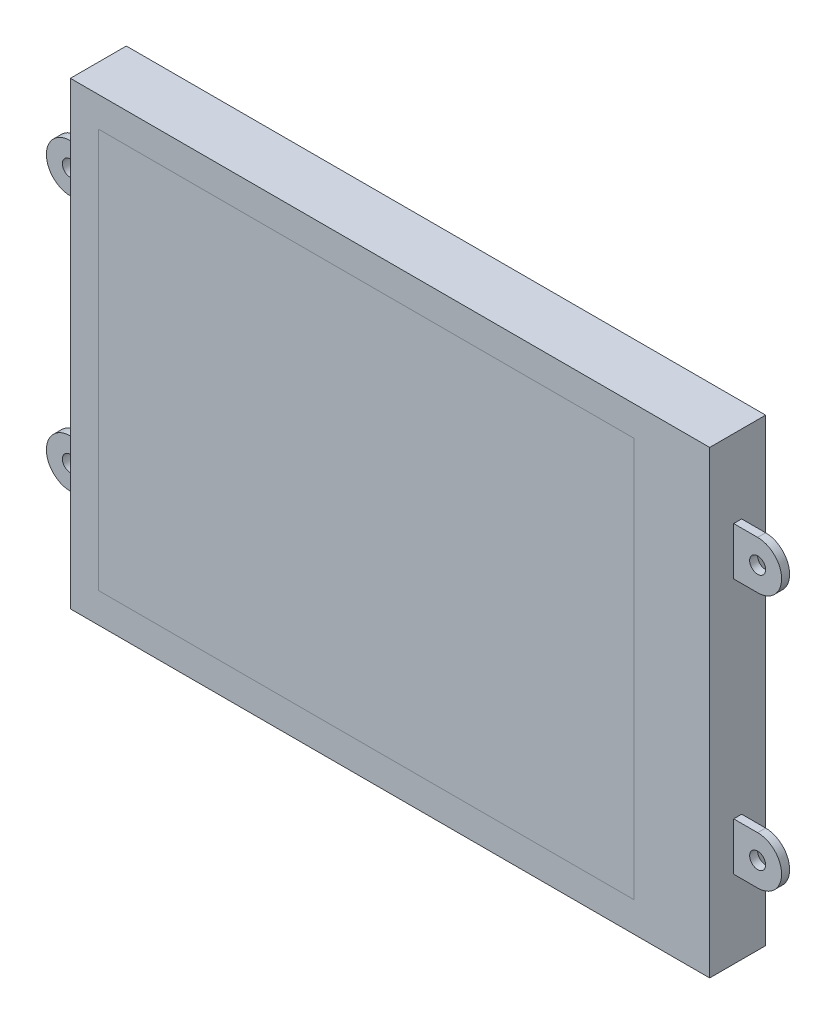
ISO-10303-21;
HEADER;
FILE_DESCRIPTION(('STEP AP214'),'2;1');
FILE_NAME('part.step','',(''),(''),'','','');
FILE_SCHEMA(('AUTOMOTIVE_DESIGN { 1 0 10303 214 1 1 1 1 }'));
ENDSEC;
DATA;
#1=APPLICATION_CONTEXT('core data for automotive mechanical design processes');
#2=APPLICATION_PROTOCOL_DEFINITION('international standard','automotive_design',2000,#1);
#3=PRODUCT_CONTEXT('',#1,'mechanical');
#4=PRODUCT('Part','Part','',(#3));
#5=PRODUCT_RELATED_PRODUCT_CATEGORY('part','',(#4));
#6=PRODUCT_DEFINITION_FORMATION('','',#4);
#7=PRODUCT_DEFINITION_CONTEXT('part definition',#1,'design');
#8=PRODUCT_DEFINITION('design','',#6,#7);
#9=PRODUCT_DEFINITION_SHAPE('','',#8);
#10=(LENGTH_UNIT() NAMED_UNIT(*) SI_UNIT(.MILLI.,.METRE.));
#11=(NAMED_UNIT(*) PLANE_ANGLE_UNIT() SI_UNIT($,.RADIAN.));
#12=(NAMED_UNIT(*) SI_UNIT($,.STERADIAN.) SOLID_ANGLE_UNIT());
#13=UNCERTAINTY_MEASURE_WITH_UNIT(LENGTH_MEASURE(1.E-05),#10,'distance_accuracy_value','');
#14=(GEOMETRIC_REPRESENTATION_CONTEXT(3) GLOBAL_UNCERTAINTY_ASSIGNED_CONTEXT((#13)) GLOBAL_UNIT_ASSIGNED_CONTEXT((#10,
#11,#12)) REPRESENTATION_CONTEXT('',''));
#15=CARTESIAN_POINT('',(0.,0.,0.));
#16=DIRECTION('',(0.,0.,1.));
#17=DIRECTION('',(1.,0.,0.));
#18=AXIS2_PLACEMENT_3D('',#15,#16,#17);
#19=CARTESIAN_POINT('',(0.,0.,3.5));
#20=DIRECTION('',(0.,0.,-1.));
#21=DIRECTION('',(-1.,0.,0.));
#22=AXIS2_PLACEMENT_3D('',#19,#20,#21);
#23=PLANE('',#22);
#24=DIRECTION('',(0.,1.,0.));
#25=VECTOR('',#24,1.);
#26=CARTESIAN_POINT('',(40.,-28.75,3.5));
#27=LINE('',#26,#25);
#28=CARTESIAN_POINT('',(40.,-28.75,3.5));
#29=VERTEX_POINT('',#28);
#30=CARTESIAN_POINT('',(40.,28.75,3.5));
#31=VERTEX_POINT('',#30);
#32=EDGE_CURVE('E327',#29,#31,#27,.T.);
#33=ORIENTED_EDGE('',*,*,#32,.T.);
#34=DIRECTION('',(-1.,0.,0.));
#35=VECTOR('',#34,1.);
#36=CARTESIAN_POINT('',(-40.,28.75,3.5));
#37=LINE('',#36,#35);
#38=CARTESIAN_POINT('',(-40.,28.75,3.5));
#39=VERTEX_POINT('',#38);
#40=EDGE_CURVE('E330',#31,#39,#37,.T.);
#41=ORIENTED_EDGE('',*,*,#40,.T.);
#42=DIRECTION('',(0.,-1.,0.));
#43=VECTOR('',#42,1.);
#44=CARTESIAN_POINT('',(-40.,-28.75,3.5));
#45=LINE('',#44,#43);
#46=CARTESIAN_POINT('',(-40.,-28.75,3.5));
#47=VERTEX_POINT('',#46);
#48=EDGE_CURVE('E333',#39,#47,#45,.T.);
#49=ORIENTED_EDGE('',*,*,#48,.T.);
#50=DIRECTION('',(1.,0.,0.));
#51=VECTOR('',#50,1.);
#52=CARTESIAN_POINT('',(-40.,-28.75,3.5));
#53=LINE('',#52,#51);
#54=EDGE_CURVE('E335',#47,#29,#53,.T.);
#55=ORIENTED_EDGE('',*,*,#54,.T.);
#56=EDGE_LOOP('',(#33,#41,#49,#55));
#57=FACE_BOUND('',#56,.T.);
#58=DIRECTION('',(0.,1.,0.));
#59=VECTOR('',#58,1.);
#60=CARTESIAN_POINT('',(30.5,0.,3.5));
#61=LINE('',#60,#59);
#62=CARTESIAN_POINT('',(30.5,-25.,3.5));
#63=VERTEX_POINT('',#62);
#64=CARTESIAN_POINT('',(30.5,25.,3.5));
#65=VERTEX_POINT('',#64);
#66=EDGE_CURVE('E11',#63,#65,#61,.T.);
#67=ORIENTED_EDGE('',*,*,#66,.F.);
#68=DIRECTION('',(1.,0.,0.));
#69=VECTOR('',#68,1.);
#70=CARTESIAN_POINT('',(0.,-25.,3.5));
#71=LINE('',#70,#69);
#72=CARTESIAN_POINT('',(-36.5,-25.,3.5));
#73=VERTEX_POINT('',#72);
#74=EDGE_CURVE('E356',#73,#63,#71,.T.);
#75=ORIENTED_EDGE('',*,*,#74,.F.);
#76=DIRECTION('',(0.,-1.,0.));
#77=VECTOR('',#76,1.);
#78=CARTESIAN_POINT('',(-36.5,0.,3.5));
#79=LINE('',#78,#77);
#80=CARTESIAN_POINT('',(-36.5,25.,3.5));
#81=VERTEX_POINT('',#80);
#82=EDGE_CURVE('E359',#81,#73,#79,.T.);
#83=ORIENTED_EDGE('',*,*,#82,.F.);
#84=DIRECTION('',(-1.,0.,0.));
#85=VECTOR('',#84,1.);
#86=CARTESIAN_POINT('',(0.,25.,3.5));
#87=LINE('',#86,#85);
#88=EDGE_CURVE('E46',#65,#81,#87,.T.);
#89=ORIENTED_EDGE('',*,*,#88,.F.);
#90=EDGE_LOOP('',(#67,#75,#83,#89));
#91=FACE_BOUND('',#90,.T.);
#92=ADVANCED_FACE('F37',(#57,#91),#23,.F.);
#93=CARTESIAN_POINT('',(-40.,-28.75,3.5));
#94=DIRECTION('',(1.,0.,0.));
#95=DIRECTION('',(0.,0.,-1.));
#96=AXIS2_PLACEMENT_3D('',#93,#94,#95);
#97=PLANE('',#96);
#98=DIRECTION('',(0.,0.,-1.));
#99=VECTOR('',#98,1.);
#100=CARTESIAN_POINT('',(-40.,13.,0.5));
#101=LINE('',#100,#99);
#102=CARTESIAN_POINT('',(-40.,13.,0.5));
#103=VERTEX_POINT('',#102);
#104=CARTESIAN_POINT('',(-40.,13.,-0.5));
#105=VERTEX_POINT('',#104);
#106=EDGE_CURVE('E247',#103,#105,#101,.T.);
#107=ORIENTED_EDGE('',*,*,#106,.T.);
#108=DIRECTION('',(0.,1.,0.));
#109=VECTOR('',#108,1.);
#110=CARTESIAN_POINT('',(-40.,13.,-0.5));
#111=LINE('',#110,#109);
#112=CARTESIAN_POINT('',(-40.,19.,-0.5));
#113=VERTEX_POINT('',#112);
#114=EDGE_CURVE('E239',#105,#113,#111,.T.);
#115=ORIENTED_EDGE('',*,*,#114,.T.);
#116=DIRECTION('',(0.,0.,-1.));
#117=VECTOR('',#116,1.);
#118=CARTESIAN_POINT('',(-40.,19.,0.5));
#119=LINE('',#118,#117);
#120=CARTESIAN_POINT('',(-40.,19.,0.5));
#121=VERTEX_POINT('',#120);
#122=EDGE_CURVE('E244',#121,#113,#119,.T.);
#123=ORIENTED_EDGE('',*,*,#122,.F.);
#124=DIRECTION('',(0.,1.,0.));
#125=VECTOR('',#124,1.);
#126=CARTESIAN_POINT('',(-40.,13.,0.5));
#127=LINE('',#126,#125);
#128=EDGE_CURVE('E228',#103,#121,#127,.T.);
#129=ORIENTED_EDGE('',*,*,#128,.F.);
#130=EDGE_LOOP('',(#107,#115,#123,#129));
#131=FACE_BOUND('',#130,.T.);
#132=DIRECTION('',(0.,-1.,0.));
#133=VECTOR('',#132,1.);
#134=CARTESIAN_POINT('',(-40.,-28.75,-3.5));
#135=LINE('',#134,#133);
#136=CARTESIAN_POINT('',(-40.,28.75,-3.5));
#137=VERTEX_POINT('',#136);
#138=CARTESIAN_POINT('',(-40.,-28.75,-3.5));
#139=VERTEX_POINT('',#138);
#140=EDGE_CURVE('E342',#137,#139,#135,.T.);
#141=ORIENTED_EDGE('',*,*,#140,.T.);
#142=DIRECTION('',(0.,0.,-1.));
#143=VECTOR('',#142,1.);
#144=CARTESIAN_POINT('',(-40.,-28.75,3.5));
#145=LINE('',#144,#143);
#146=EDGE_CURVE('E347',#47,#139,#145,.T.);
#147=ORIENTED_EDGE('',*,*,#146,.F.);
#148=ORIENTED_EDGE('',*,*,#48,.F.);
#149=DIRECTION('',(0.,0.,-1.));
#150=VECTOR('',#149,1.);
#151=CARTESIAN_POINT('',(-40.,28.75,3.5));
#152=LINE('',#151,#150);
#153=EDGE_CURVE('E350',#39,#137,#152,.T.);
#154=ORIENTED_EDGE('',*,*,#153,.T.);
#155=EDGE_LOOP('',(#141,#147,#148,#154));
#156=FACE_BOUND('',#155,.T.);
#157=DIRECTION('',(0.,0.,-1.));
#158=VECTOR('',#157,1.);
#159=CARTESIAN_POINT('',(-40.,-19.,0.5));
#160=LINE('',#159,#158);
#161=CARTESIAN_POINT('',(-40.,-19.,0.5));
#162=VERTEX_POINT('',#161);
#163=CARTESIAN_POINT('',(-40.,-19.,-0.5));
#164=VERTEX_POINT('',#163);
#165=EDGE_CURVE('E190',#162,#164,#160,.T.);
#166=ORIENTED_EDGE('',*,*,#165,.T.);
#167=DIRECTION('',(0.,1.,0.));
#168=VECTOR('',#167,1.);
#169=CARTESIAN_POINT('',(-40.,-13.,-0.5));
#170=LINE('',#169,#168);
#171=CARTESIAN_POINT('',(-40.,-13.,-0.5));
#172=VERTEX_POINT('',#171);
#173=EDGE_CURVE('E415',#164,#172,#170,.T.);
#174=ORIENTED_EDGE('',*,*,#173,.T.);
#175=DIRECTION('',(0.,0.,-1.));
#176=VECTOR('',#175,1.);
#177=CARTESIAN_POINT('',(-40.,-13.,0.5));
#178=LINE('',#177,#176);
#179=CARTESIAN_POINT('',(-40.,-13.,0.5));
#180=VERTEX_POINT('',#179);
#181=EDGE_CURVE('E214',#180,#172,#178,.T.);
#182=ORIENTED_EDGE('',*,*,#181,.F.);
#183=DIRECTION('',(0.,1.,0.));
#184=VECTOR('',#183,1.);
#185=CARTESIAN_POINT('',(-40.,-13.,0.5));
#186=LINE('',#185,#184);
#187=EDGE_CURVE('E193',#162,#180,#186,.T.);
#188=ORIENTED_EDGE('',*,*,#187,.F.);
#189=EDGE_LOOP('',(#166,#174,#182,#188));
#190=FACE_BOUND('',#189,.T.);
#191=ADVANCED_FACE('F374',(#131,#156,#190),#97,.F.);
#192=CARTESIAN_POINT('',(40.,-28.75,3.5));
#193=DIRECTION('',(-1.,0.,0.));
#194=DIRECTION('',(0.,0.,1.));
#195=AXIS2_PLACEMENT_3D('',#192,#193,#194);
#196=PLANE('',#195);
#197=DIRECTION('',(0.,0.,-1.));
#198=VECTOR('',#197,1.);
#199=CARTESIAN_POINT('',(40.,13.,0.5));
#200=LINE('',#199,#198);
#201=CARTESIAN_POINT('',(40.,13.,0.5));
#202=VERTEX_POINT('',#201);
#203=CARTESIAN_POINT('',(40.,13.,-0.5));
#204=VERTEX_POINT('',#203);
#205=EDGE_CURVE('E323',#202,#204,#200,.T.);
#206=ORIENTED_EDGE('',*,*,#205,.F.);
#207=DIRECTION('',(0.,-1.,0.));
#208=VECTOR('',#207,1.);
#209=CARTESIAN_POINT('',(40.,19.,0.5));
#210=LINE('',#209,#208);
#211=CARTESIAN_POINT('',(40.,19.,0.5));
#212=VERTEX_POINT('',#211);
#213=EDGE_CURVE('E297',#212,#202,#210,.T.);
#214=ORIENTED_EDGE('',*,*,#213,.F.);
#215=DIRECTION('',(0.,0.,-1.));
#216=VECTOR('',#215,1.);
#217=CARTESIAN_POINT('',(40.,19.,0.5));
#218=LINE('',#217,#216);
#219=CARTESIAN_POINT('',(40.,19.,-0.5));
#220=VERTEX_POINT('',#219);
#221=EDGE_CURVE('E308',#212,#220,#218,.T.);
#222=ORIENTED_EDGE('',*,*,#221,.T.);
#223=DIRECTION('',(0.,-1.,0.));
#224=VECTOR('',#223,1.);
#225=CARTESIAN_POINT('',(40.,19.,-0.5));
#226=LINE('',#225,#224);
#227=EDGE_CURVE('E294',#220,#204,#226,.T.);
#228=ORIENTED_EDGE('',*,*,#227,.T.);
#229=EDGE_LOOP('',(#206,#214,#222,#228));
#230=FACE_BOUND('',#229,.T.);
#231=DIRECTION('',(0.,1.,0.));
#232=VECTOR('',#231,1.);
#233=CARTESIAN_POINT('',(40.,-28.75,-3.5));
#234=LINE('',#233,#232);
#235=CARTESIAN_POINT('',(40.,-28.75,-3.5));
#236=VERTEX_POINT('',#235);
#237=CARTESIAN_POINT('',(40.,28.75,-3.5));
#238=VERTEX_POINT('',#237);
#239=EDGE_CURVE('E326',#236,#238,#234,.T.);
#240=ORIENTED_EDGE('',*,*,#239,.T.);
#241=DIRECTION('',(0.,0.,-1.));
#242=VECTOR('',#241,1.);
#243=CARTESIAN_POINT('',(40.,28.75,3.5));
#244=LINE('',#243,#242);
#245=EDGE_CURVE('E353',#31,#238,#244,.T.);
#246=ORIENTED_EDGE('',*,*,#245,.F.);
#247=ORIENTED_EDGE('',*,*,#32,.F.);
#248=DIRECTION('',(0.,0.,-1.));
#249=VECTOR('',#248,1.);
#250=CARTESIAN_POINT('',(40.,-28.75,3.5));
#251=LINE('',#250,#249);
#252=EDGE_CURVE('E337',#29,#236,#251,.T.);
#253=ORIENTED_EDGE('',*,*,#252,.T.);
#254=EDGE_LOOP('',(#240,#246,#247,#253));
#255=FACE_BOUND('',#254,.T.);
#256=DIRECTION('',(0.,0.,-1.));
#257=VECTOR('',#256,1.);
#258=CARTESIAN_POINT('',(40.,-13.,0.5));
#259=LINE('',#258,#257);
#260=CARTESIAN_POINT('',(40.,-13.,0.5));
#261=VERTEX_POINT('',#260);
#262=CARTESIAN_POINT('',(40.,-13.,-0.5));
#263=VERTEX_POINT('',#262);
#264=EDGE_CURVE('E285',#261,#263,#259,.T.);
#265=ORIENTED_EDGE('',*,*,#264,.T.);
#266=DIRECTION('',(0.,-1.,0.));
#267=VECTOR('',#266,1.);
#268=CARTESIAN_POINT('',(40.,-13.,-0.5));
#269=LINE('',#268,#267);
#270=CARTESIAN_POINT('',(40.,-19.,-0.5));
#271=VERTEX_POINT('',#270);
#272=EDGE_CURVE('E277',#263,#271,#269,.T.);
#273=ORIENTED_EDGE('',*,*,#272,.T.);
#274=DIRECTION('',(0.,0.,-1.));
#275=VECTOR('',#274,1.);
#276=CARTESIAN_POINT('',(40.,-19.,0.5));
#277=LINE('',#276,#275);
#278=CARTESIAN_POINT('',(40.,-19.,0.5));
#279=VERTEX_POINT('',#278);
#280=EDGE_CURVE('E282',#279,#271,#277,.T.);
#281=ORIENTED_EDGE('',*,*,#280,.F.);
#282=DIRECTION('',(0.,-1.,0.));
#283=VECTOR('',#282,1.);
#284=CARTESIAN_POINT('',(40.,-13.,0.5));
#285=LINE('',#284,#283);
#286=EDGE_CURVE('E266',#261,#279,#285,.T.);
#287=ORIENTED_EDGE('',*,*,#286,.F.);
#288=EDGE_LOOP('',(#265,#273,#281,#287));
#289=FACE_BOUND('',#288,.T.);
#290=ADVANCED_FACE('F39',(#230,#255,#289),#196,.F.);
#291=CARTESIAN_POINT('',(-40.,28.75,3.5));
#292=DIRECTION('',(0.,-1.,0.));
#293=DIRECTION('',(0.,0.,-1.));
#294=AXIS2_PLACEMENT_3D('',#291,#292,#293);
#295=PLANE('',#294);
#296=DIRECTION('',(-1.,0.,0.));
#297=VECTOR('',#296,1.);
#298=CARTESIAN_POINT('',(-40.,28.75,-3.5));
#299=LINE('',#298,#297);
#300=EDGE_CURVE('E340',#238,#137,#299,.T.);
#301=ORIENTED_EDGE('',*,*,#300,.T.);
#302=ORIENTED_EDGE('',*,*,#153,.F.);
#303=ORIENTED_EDGE('',*,*,#40,.F.);
#304=ORIENTED_EDGE('',*,*,#245,.T.);
#305=EDGE_LOOP('',(#301,#302,#303,#304));
#306=FACE_BOUND('',#305,.T.);
#307=ADVANCED_FACE('F393',(#306),#295,.F.);
#308=CARTESIAN_POINT('',(-40.,-28.75,3.5));
#309=DIRECTION('',(0.,1.,0.));
#310=DIRECTION('',(0.,0.,1.));
#311=AXIS2_PLACEMENT_3D('',#308,#309,#310);
#312=PLANE('',#311);
#313=DIRECTION('',(1.,0.,0.));
#314=VECTOR('',#313,1.);
#315=CARTESIAN_POINT('',(-40.,-28.75,-3.5));
#316=LINE('',#315,#314);
#317=EDGE_CURVE('E331',#139,#236,#316,.T.);
#318=ORIENTED_EDGE('',*,*,#317,.T.);
#319=ORIENTED_EDGE('',*,*,#252,.F.);
#320=ORIENTED_EDGE('',*,*,#54,.F.);
#321=ORIENTED_EDGE('',*,*,#146,.T.);
#322=EDGE_LOOP('',(#318,#319,#320,#321));
#323=FACE_BOUND('',#322,.T.);
#324=ADVANCED_FACE('F386',(#323),#312,.F.);
#325=ORIENTED_EDGE('',*,*,#74,.T.);
#326=ORIENTED_EDGE('',*,*,#66,.T.);
#327=ORIENTED_EDGE('',*,*,#88,.T.);
#328=ORIENTED_EDGE('',*,*,#82,.T.);
#329=EDGE_LOOP('',(#325,#326,#327,#328));
#330=FACE_BOUND('',#329,.T.);
#331=ADVANCED_FACE('F371',(#330),#23,.F.);
#332=CARTESIAN_POINT('',(0.,0.,-3.5));
#333=DIRECTION('',(0.,0.,-1.));
#334=DIRECTION('',(-1.,0.,0.));
#335=AXIS2_PLACEMENT_3D('',#332,#333,#334);
#336=PLANE('',#335);
#337=ORIENTED_EDGE('',*,*,#239,.F.);
#338=ORIENTED_EDGE('',*,*,#317,.F.);
#339=ORIENTED_EDGE('',*,*,#140,.F.);
#340=ORIENTED_EDGE('',*,*,#300,.F.);
#341=EDGE_LOOP('',(#337,#338,#339,#340));
#342=FACE_BOUND('',#341,.T.);
#343=ADVANCED_FACE('F385',(#342),#336,.T.);
#344=CARTESIAN_POINT('',(43.,16.,0.5));
#345=DIRECTION('',(0.,0.,1.));
#346=DIRECTION('',(1.,0.,0.));
#347=AXIS2_PLACEMENT_3D('',#344,#345,#346);
#348=PLANE('',#347);
#349=ORIENTED_EDGE('',*,*,#213,.T.);
#350=DIRECTION('',(1.,0.,0.));
#351=VECTOR('',#350,1.);
#352=CARTESIAN_POINT('',(43.,13.,0.5));
#353=LINE('',#352,#351);
#354=CARTESIAN_POINT('',(43.,13.,0.5));
#355=VERTEX_POINT('',#354);
#356=EDGE_CURVE('E300',#202,#355,#353,.T.);
#357=ORIENTED_EDGE('',*,*,#356,.T.);
#358=CARTESIAN_POINT('',(43.,16.,0.5));
#359=DIRECTION('',(0.,0.,1.));
#360=DIRECTION('',(1.,0.,0.));
#361=AXIS2_PLACEMENT_3D('',#358,#359,#360);
#362=CIRCLE('',#361,3.);
#363=CARTESIAN_POINT('',(43.,19.,0.5));
#364=VERTEX_POINT('',#363);
#365=EDGE_CURVE('E303',#355,#364,#362,.T.);
#366=ORIENTED_EDGE('',*,*,#365,.T.);
#367=DIRECTION('',(-1.,0.,0.));
#368=VECTOR('',#367,1.);
#369=CARTESIAN_POINT('',(40.,19.,0.5));
#370=LINE('',#369,#368);
#371=EDGE_CURVE('E305',#364,#212,#370,.T.);
#372=ORIENTED_EDGE('',*,*,#371,.T.);
#373=EDGE_LOOP('',(#349,#357,#366,#372));
#374=FACE_BOUND('',#373,.T.);
#375=CARTESIAN_POINT('',(43.,16.,0.5));
#376=DIRECTION('',(0.,0.,1.));
#377=DIRECTION('',(1.,0.,0.));
#378=AXIS2_PLACEMENT_3D('',#375,#376,#377);
#379=CIRCLE('',#378,0.999999999999998);
#380=CARTESIAN_POINT('',(44.,16.,0.5));
#381=VERTEX_POINT('',#380);
#382=EDGE_CURVE('E291',#381,#381,#379,.T.);
#383=ORIENTED_EDGE('',*,*,#382,.F.);
#384=EDGE_LOOP('',(#383));
#385=FACE_BOUND('',#384,.T.);
#386=ADVANCED_FACE('F391',(#374,#385),#348,.T.);
#387=CARTESIAN_POINT('',(43.,16.,-0.5));
#388=DIRECTION('',(0.,0.,1.));
#389=DIRECTION('',(1.,0.,0.));
#390=AXIS2_PLACEMENT_3D('',#387,#388,#389);
#391=PLANE('',#390);
#392=ORIENTED_EDGE('',*,*,#227,.F.);
#393=DIRECTION('',(-1.,0.,0.));
#394=VECTOR('',#393,1.);
#395=CARTESIAN_POINT('',(40.,19.,-0.5));
#396=LINE('',#395,#394);
#397=CARTESIAN_POINT('',(43.,19.,-0.5));
#398=VERTEX_POINT('',#397);
#399=EDGE_CURVE('E301',#398,#220,#396,.T.);
#400=ORIENTED_EDGE('',*,*,#399,.F.);
#401=CARTESIAN_POINT('',(43.,16.,-0.5));
#402=DIRECTION('',(0.,0.,1.));
#403=DIRECTION('',(1.,0.,0.));
#404=AXIS2_PLACEMENT_3D('',#401,#402,#403);
#405=CIRCLE('',#404,3.);
#406=CARTESIAN_POINT('',(43.,13.,-0.5));
#407=VERTEX_POINT('',#406);
#408=EDGE_CURVE('E312',#407,#398,#405,.T.);
#409=ORIENTED_EDGE('',*,*,#408,.F.);
#410=DIRECTION('',(1.,0.,0.));
#411=VECTOR('',#410,1.);
#412=CARTESIAN_POINT('',(43.,13.,-0.5));
#413=LINE('',#412,#411);
#414=EDGE_CURVE('E310',#204,#407,#413,.T.);
#415=ORIENTED_EDGE('',*,*,#414,.F.);
#416=EDGE_LOOP('',(#392,#400,#409,#415));
#417=FACE_BOUND('',#416,.T.);
#418=CARTESIAN_POINT('',(43.,16.,-0.5));
#419=DIRECTION('',(0.,0.,1.));
#420=DIRECTION('',(1.,0.,0.));
#421=AXIS2_PLACEMENT_3D('',#418,#419,#420);
#422=CIRCLE('',#421,0.999999999999998);
#423=CARTESIAN_POINT('',(44.,16.,-0.5));
#424=VERTEX_POINT('',#423);
#425=EDGE_CURVE('E290',#424,#424,#422,.T.);
#426=ORIENTED_EDGE('',*,*,#425,.T.);
#427=EDGE_LOOP('',(#426));
#428=FACE_BOUND('',#427,.T.);
#429=ADVANCED_FACE('F513',(#417,#428),#391,.F.);
#430=CARTESIAN_POINT('',(43.,13.,0.5));
#431=DIRECTION('',(0.,1.,0.));
#432=DIRECTION('',(-1.,0.,0.));
#433=AXIS2_PLACEMENT_3D('',#430,#431,#432);
#434=PLANE('',#433);
#435=ORIENTED_EDGE('',*,*,#414,.T.);
#436=DIRECTION('',(0.,0.,-1.));
#437=VECTOR('',#436,1.);
#438=CARTESIAN_POINT('',(43.,13.,0.5));
#439=LINE('',#438,#437);
#440=EDGE_CURVE('E320',#355,#407,#439,.T.);
#441=ORIENTED_EDGE('',*,*,#440,.F.);
#442=ORIENTED_EDGE('',*,*,#356,.F.);
#443=ORIENTED_EDGE('',*,*,#205,.T.);
#444=EDGE_LOOP('',(#435,#441,#442,#443));
#445=FACE_BOUND('',#444,.T.);
#446=ADVANCED_FACE('F517',(#445),#434,.F.);
#447=CARTESIAN_POINT('',(43.,16.,0.5));
#448=DIRECTION('',(0.,0.,-1.));
#449=DIRECTION('',(-1.,0.,0.));
#450=AXIS2_PLACEMENT_3D('',#447,#448,#449);
#451=CYLINDRICAL_SURFACE('',#450,3.);
#452=ORIENTED_EDGE('',*,*,#408,.T.);
#453=DIRECTION('',(0.,0.,-1.));
#454=VECTOR('',#453,1.);
#455=CARTESIAN_POINT('',(43.,19.,0.5));
#456=LINE('',#455,#454);
#457=EDGE_CURVE('E317',#364,#398,#456,.T.);
#458=ORIENTED_EDGE('',*,*,#457,.F.);
#459=ORIENTED_EDGE('',*,*,#365,.F.);
#460=ORIENTED_EDGE('',*,*,#440,.T.);
#461=EDGE_LOOP('',(#452,#458,#459,#460));
#462=FACE_BOUND('',#461,.T.);
#463=ADVANCED_FACE('F521',(#462),#451,.T.);
#464=CARTESIAN_POINT('',(40.,19.,0.5));
#465=DIRECTION('',(0.,-1.,0.));
#466=DIRECTION('',(0.,0.,-1.));
#467=AXIS2_PLACEMENT_3D('',#464,#465,#466);
#468=PLANE('',#467);
#469=ORIENTED_EDGE('',*,*,#399,.T.);
#470=ORIENTED_EDGE('',*,*,#221,.F.);
#471=ORIENTED_EDGE('',*,*,#371,.F.);
#472=ORIENTED_EDGE('',*,*,#457,.T.);
#473=EDGE_LOOP('',(#469,#470,#471,#472));
#474=FACE_BOUND('',#473,.T.);
#475=ADVANCED_FACE('F509',(#474),#468,.F.);
#476=CARTESIAN_POINT('',(43.,16.,0.5));
#477=DIRECTION('',(0.,0.,-1.));
#478=DIRECTION('',(-1.,0.,0.));
#479=AXIS2_PLACEMENT_3D('',#476,#477,#478);
#480=CYLINDRICAL_SURFACE('',#479,0.999999999999998);
#481=ORIENTED_EDGE('',*,*,#382,.T.);
#482=EDGE_LOOP('',(#481));
#483=FACE_BOUND('',#482,.T.);
#484=ORIENTED_EDGE('',*,*,#425,.F.);
#485=EDGE_LOOP('',(#484));
#486=FACE_BOUND('',#485,.T.);
#487=ADVANCED_FACE('F491',(#483,#486),#480,.F.);
#488=CARTESIAN_POINT('',(43.,-16.,0.5));
#489=DIRECTION('',(0.,0.,1.));
#490=DIRECTION('',(1.,0.,0.));
#491=AXIS2_PLACEMENT_3D('',#488,#489,#490);
#492=PLANE('',#491);
#493=CARTESIAN_POINT('',(43.,-16.,0.5));
#494=DIRECTION('',(0.,0.,1.));
#495=DIRECTION('',(1.,0.,0.));
#496=AXIS2_PLACEMENT_3D('',#493,#494,#495);
#497=CIRCLE('',#496,3.);
#498=CARTESIAN_POINT('',(43.,-19.,0.5));
#499=VERTEX_POINT('',#498);
#500=CARTESIAN_POINT('',(43.,-13.,0.5));
#501=VERTEX_POINT('',#500);
#502=EDGE_CURVE('E259',#499,#501,#497,.T.);
#503=ORIENTED_EDGE('',*,*,#502,.T.);
#504=DIRECTION('',(-1.,0.,0.));
#505=VECTOR('',#504,1.);
#506=CARTESIAN_POINT('',(43.,-13.,0.5));
#507=LINE('',#506,#505);
#508=EDGE_CURVE('E262',#501,#261,#507,.T.);
#509=ORIENTED_EDGE('',*,*,#508,.T.);
#510=ORIENTED_EDGE('',*,*,#286,.T.);
#511=DIRECTION('',(1.,0.,0.));
#512=VECTOR('',#511,1.);
#513=CARTESIAN_POINT('',(43.,-19.,0.5));
#514=LINE('',#513,#512);
#515=EDGE_CURVE('E269',#279,#499,#514,.T.);
#516=ORIENTED_EDGE('',*,*,#515,.T.);
#517=EDGE_LOOP('',(#503,#509,#510,#516));
#518=FACE_BOUND('',#517,.T.);
#519=CARTESIAN_POINT('',(43.,-16.,0.5));
#520=DIRECTION('',(0.,0.,1.));
#521=DIRECTION('',(1.,0.,0.));
#522=AXIS2_PLACEMENT_3D('',#519,#520,#521);
#523=CIRCLE('',#522,0.999999999999998);
#524=CARTESIAN_POINT('',(44.,-16.,0.5));
#525=VERTEX_POINT('',#524);
#526=EDGE_CURVE('E253',#525,#525,#523,.T.);
#527=ORIENTED_EDGE('',*,*,#526,.F.);
#528=EDGE_LOOP('',(#527));
#529=FACE_BOUND('',#528,.T.);
#530=ADVANCED_FACE('F487',(#518,#529),#492,.T.);
#531=CARTESIAN_POINT('',(43.,-16.,-0.5));
#532=DIRECTION('',(0.,0.,1.));
#533=DIRECTION('',(1.,0.,0.));
#534=AXIS2_PLACEMENT_3D('',#531,#532,#533);
#535=PLANE('',#534);
#536=CARTESIAN_POINT('',(43.,-16.,-0.5));
#537=DIRECTION('',(0.,0.,1.));
#538=DIRECTION('',(1.,0.,0.));
#539=AXIS2_PLACEMENT_3D('',#536,#537,#538);
#540=CIRCLE('',#539,3.);
#541=CARTESIAN_POINT('',(43.,-19.,-0.5));
#542=VERTEX_POINT('',#541);
#543=CARTESIAN_POINT('',(43.,-13.,-0.5));
#544=VERTEX_POINT('',#543);
#545=EDGE_CURVE('E256',#542,#544,#540,.T.);
#546=ORIENTED_EDGE('',*,*,#545,.F.);
#547=DIRECTION('',(1.,0.,0.));
#548=VECTOR('',#547,1.);
#549=CARTESIAN_POINT('',(43.,-19.,-0.5));
#550=LINE('',#549,#548);
#551=EDGE_CURVE('E263',#271,#542,#550,.T.);
#552=ORIENTED_EDGE('',*,*,#551,.F.);
#553=ORIENTED_EDGE('',*,*,#272,.F.);
#554=DIRECTION('',(-1.,0.,0.));
#555=VECTOR('',#554,1.);
#556=CARTESIAN_POINT('',(43.,-13.,-0.5));
#557=LINE('',#556,#555);
#558=EDGE_CURVE('E274',#544,#263,#557,.T.);
#559=ORIENTED_EDGE('',*,*,#558,.F.);
#560=EDGE_LOOP('',(#546,#552,#553,#559));
#561=FACE_BOUND('',#560,.T.);
#562=CARTESIAN_POINT('',(43.,-16.,-0.5));
#563=DIRECTION('',(0.,0.,1.));
#564=DIRECTION('',(1.,0.,0.));
#565=AXIS2_PLACEMENT_3D('',#562,#563,#564);
#566=CIRCLE('',#565,0.999999999999998);
#567=CARTESIAN_POINT('',(44.,-16.,-0.5));
#568=VERTEX_POINT('',#567);
#569=EDGE_CURVE('E252',#568,#568,#566,.T.);
#570=ORIENTED_EDGE('',*,*,#569,.T.);
#571=EDGE_LOOP('',(#570));
#572=FACE_BOUND('',#571,.T.);
#573=ADVANCED_FACE('F490',(#561,#572),#535,.F.);
#574=CARTESIAN_POINT('',(43.,-16.,0.5));
#575=DIRECTION('',(0.,0.,-1.));
#576=DIRECTION('',(-1.,0.,0.));
#577=AXIS2_PLACEMENT_3D('',#574,#575,#576);
#578=CYLINDRICAL_SURFACE('',#577,3.);
#579=ORIENTED_EDGE('',*,*,#545,.T.);
#580=DIRECTION('',(0.,0.,-1.));
#581=VECTOR('',#580,1.);
#582=CARTESIAN_POINT('',(43.,-13.,0.5));
#583=LINE('',#582,#581);
#584=EDGE_CURVE('E287',#501,#544,#583,.T.);
#585=ORIENTED_EDGE('',*,*,#584,.F.);
#586=ORIENTED_EDGE('',*,*,#502,.F.);
#587=DIRECTION('',(0.,0.,-1.));
#588=VECTOR('',#587,1.);
#589=CARTESIAN_POINT('',(43.,-19.,0.5));
#590=LINE('',#589,#588);
#591=EDGE_CURVE('E271',#499,#542,#590,.T.);
#592=ORIENTED_EDGE('',*,*,#591,.T.);
#593=EDGE_LOOP('',(#579,#585,#586,#592));
#594=FACE_BOUND('',#593,.T.);
#595=ADVANCED_FACE('F495',(#594),#578,.T.);
#596=CARTESIAN_POINT('',(43.,-13.,0.5));
#597=DIRECTION('',(0.,-1.,0.));
#598=DIRECTION('',(1.,0.,0.));
#599=AXIS2_PLACEMENT_3D('',#596,#597,#598);
#600=PLANE('',#599);
#601=ORIENTED_EDGE('',*,*,#558,.T.);
#602=ORIENTED_EDGE('',*,*,#264,.F.);
#603=ORIENTED_EDGE('',*,*,#508,.F.);
#604=ORIENTED_EDGE('',*,*,#584,.T.);
#605=EDGE_LOOP('',(#601,#602,#603,#604));
#606=FACE_BOUND('',#605,.T.);
#607=ADVANCED_FACE('F499',(#606),#600,.F.);
#608=CARTESIAN_POINT('',(43.,-19.,0.5));
#609=DIRECTION('',(0.,1.,0.));
#610=DIRECTION('',(0.,0.,1.));
#611=AXIS2_PLACEMENT_3D('',#608,#609,#610);
#612=PLANE('',#611);
#613=ORIENTED_EDGE('',*,*,#551,.T.);
#614=ORIENTED_EDGE('',*,*,#591,.F.);
#615=ORIENTED_EDGE('',*,*,#515,.F.);
#616=ORIENTED_EDGE('',*,*,#280,.T.);
#617=EDGE_LOOP('',(#613,#614,#615,#616));
#618=FACE_BOUND('',#617,.T.);
#619=ADVANCED_FACE('F485',(#618),#612,.F.);
#620=CARTESIAN_POINT('',(43.,-16.,0.5));
#621=DIRECTION('',(0.,0.,-1.));
#622=DIRECTION('',(-1.,0.,0.));
#623=AXIS2_PLACEMENT_3D('',#620,#621,#622);
#624=CYLINDRICAL_SURFACE('',#623,0.999999999999998);
#625=ORIENTED_EDGE('',*,*,#526,.T.);
#626=EDGE_LOOP('',(#625));
#627=FACE_BOUND('',#626,.T.);
#628=ORIENTED_EDGE('',*,*,#569,.F.);
#629=EDGE_LOOP('',(#628));
#630=FACE_BOUND('',#629,.T.);
#631=ADVANCED_FACE('F467',(#627,#630),#624,.F.);
#632=CARTESIAN_POINT('',(-43.,16.,0.5));
#633=DIRECTION('',(0.,0.,1.));
#634=DIRECTION('',(1.,0.,0.));
#635=AXIS2_PLACEMENT_3D('',#632,#633,#634);
#636=PLANE('',#635);
#637=CARTESIAN_POINT('',(-43.,16.,0.5));
#638=DIRECTION('',(0.,0.,1.));
#639=DIRECTION('',(1.,0.,0.));
#640=AXIS2_PLACEMENT_3D('',#637,#638,#639);
#641=CIRCLE('',#640,3.);
#642=CARTESIAN_POINT('',(-43.,19.,0.5));
#643=VERTEX_POINT('',#642);
#644=CARTESIAN_POINT('',(-43.,13.,0.5));
#645=VERTEX_POINT('',#644);
#646=EDGE_CURVE('E221',#643,#645,#641,.T.);
#647=ORIENTED_EDGE('',*,*,#646,.T.);
#648=DIRECTION('',(1.,0.,0.));
#649=VECTOR('',#648,1.);
#650=CARTESIAN_POINT('',(-43.,13.,0.5));
#651=LINE('',#650,#649);
#652=EDGE_CURVE('E224',#645,#103,#651,.T.);
#653=ORIENTED_EDGE('',*,*,#652,.T.);
#654=ORIENTED_EDGE('',*,*,#128,.T.);
#655=DIRECTION('',(-1.,0.,0.));
#656=VECTOR('',#655,1.);
#657=CARTESIAN_POINT('',(-43.,19.,0.5));
#658=LINE('',#657,#656);
#659=EDGE_CURVE('E231',#121,#643,#658,.T.);
#660=ORIENTED_EDGE('',*,*,#659,.T.);
#661=EDGE_LOOP('',(#647,#653,#654,#660));
#662=FACE_BOUND('',#661,.T.);
#663=CARTESIAN_POINT('',(-43.,16.,0.5));
#664=DIRECTION('',(0.,0.,1.));
#665=DIRECTION('',(1.,0.,0.));
#666=AXIS2_PLACEMENT_3D('',#663,#664,#665);
#667=CIRCLE('',#666,0.999999999999998);
#668=CARTESIAN_POINT('',(-42.,16.,0.5));
#669=VERTEX_POINT('',#668);
#670=EDGE_CURVE('E212',#669,#669,#667,.T.);
#671=ORIENTED_EDGE('',*,*,#670,.F.);
#672=EDGE_LOOP('',(#671));
#673=FACE_BOUND('',#672,.T.);
#674=ADVANCED_FACE('F463',(#662,#673),#636,.T.);
#675=CARTESIAN_POINT('',(-43.,16.,-0.5));
#676=DIRECTION('',(0.,0.,1.));
#677=DIRECTION('',(1.,0.,0.));
#678=AXIS2_PLACEMENT_3D('',#675,#676,#677);
#679=PLANE('',#678);
#680=CARTESIAN_POINT('',(-43.,16.,-0.5));
#681=DIRECTION('',(0.,0.,1.));
#682=DIRECTION('',(1.,0.,0.));
#683=AXIS2_PLACEMENT_3D('',#680,#681,#682);
#684=CIRCLE('',#683,3.);
#685=CARTESIAN_POINT('',(-43.,19.,-0.5));
#686=VERTEX_POINT('',#685);
#687=CARTESIAN_POINT('',(-43.,13.,-0.5));
#688=VERTEX_POINT('',#687);
#689=EDGE_CURVE('E219',#686,#688,#684,.T.);
#690=ORIENTED_EDGE('',*,*,#689,.F.);
#691=DIRECTION('',(-1.,0.,0.));
#692=VECTOR('',#691,1.);
#693=CARTESIAN_POINT('',(-43.,19.,-0.5));
#694=LINE('',#693,#692);
#695=EDGE_CURVE('E225',#113,#686,#694,.T.);
#696=ORIENTED_EDGE('',*,*,#695,.F.);
#697=ORIENTED_EDGE('',*,*,#114,.F.);
#698=DIRECTION('',(1.,0.,0.));
#699=VECTOR('',#698,1.);
#700=CARTESIAN_POINT('',(-43.,13.,-0.5));
#701=LINE('',#700,#699);
#702=EDGE_CURVE('E236',#688,#105,#701,.T.);
#703=ORIENTED_EDGE('',*,*,#702,.F.);
#704=EDGE_LOOP('',(#690,#696,#697,#703));
#705=FACE_BOUND('',#704,.T.);
#706=CARTESIAN_POINT('',(-43.,16.,-0.5));
#707=DIRECTION('',(0.,0.,1.));
#708=DIRECTION('',(1.,0.,0.));
#709=AXIS2_PLACEMENT_3D('',#706,#707,#708);
#710=CIRCLE('',#709,0.999999999999998);
#711=CARTESIAN_POINT('',(-42.,16.,-0.5));
#712=VERTEX_POINT('',#711);
#713=EDGE_CURVE('E209',#712,#712,#710,.T.);
#714=ORIENTED_EDGE('',*,*,#713,.T.);
#715=EDGE_LOOP('',(#714));
#716=FACE_BOUND('',#715,.T.);
#717=ADVANCED_FACE('F466',(#705,#716),#679,.F.);
#718=CARTESIAN_POINT('',(-43.,16.,0.5));
#719=DIRECTION('',(0.,0.,-1.));
#720=DIRECTION('',(-1.,0.,0.));
#721=AXIS2_PLACEMENT_3D('',#718,#719,#720);
#722=CYLINDRICAL_SURFACE('',#721,3.);
#723=ORIENTED_EDGE('',*,*,#689,.T.);
#724=DIRECTION('',(0.,0.,-1.));
#725=VECTOR('',#724,1.);
#726=CARTESIAN_POINT('',(-43.,13.,0.5));
#727=LINE('',#726,#725);
#728=EDGE_CURVE('E249',#645,#688,#727,.T.);
#729=ORIENTED_EDGE('',*,*,#728,.F.);
#730=ORIENTED_EDGE('',*,*,#646,.F.);
#731=DIRECTION('',(0.,0.,-1.));
#732=VECTOR('',#731,1.);
#733=CARTESIAN_POINT('',(-43.,19.,0.5));
#734=LINE('',#733,#732);
#735=EDGE_CURVE('E233',#643,#686,#734,.T.);
#736=ORIENTED_EDGE('',*,*,#735,.T.);
#737=EDGE_LOOP('',(#723,#729,#730,#736));
#738=FACE_BOUND('',#737,.T.);
#739=ADVANCED_FACE('F471',(#738),#722,.T.);
#740=CARTESIAN_POINT('',(-43.,13.,0.5));
#741=DIRECTION('',(0.,1.,0.));
#742=DIRECTION('',(-1.,0.,0.));
#743=AXIS2_PLACEMENT_3D('',#740,#741,#742);
#744=PLANE('',#743);
#745=ORIENTED_EDGE('',*,*,#702,.T.);
#746=ORIENTED_EDGE('',*,*,#106,.F.);
#747=ORIENTED_EDGE('',*,*,#652,.F.);
#748=ORIENTED_EDGE('',*,*,#728,.T.);
#749=EDGE_LOOP('',(#745,#746,#747,#748));
#750=FACE_BOUND('',#749,.T.);
#751=ADVANCED_FACE('F475',(#750),#744,.F.);
#752=CARTESIAN_POINT('',(-43.,19.,0.5));
#753=DIRECTION('',(0.,-1.,0.));
#754=DIRECTION('',(0.,0.,-1.));
#755=AXIS2_PLACEMENT_3D('',#752,#753,#754);
#756=PLANE('',#755);
#757=ORIENTED_EDGE('',*,*,#695,.T.);
#758=ORIENTED_EDGE('',*,*,#735,.F.);
#759=ORIENTED_EDGE('',*,*,#659,.F.);
#760=ORIENTED_EDGE('',*,*,#122,.T.);
#761=EDGE_LOOP('',(#757,#758,#759,#760));
#762=FACE_BOUND('',#761,.T.);
#763=ADVANCED_FACE('F461',(#762),#756,.F.);
#764=CARTESIAN_POINT('',(-43.,16.,0.5));
#765=DIRECTION('',(0.,0.,-1.));
#766=DIRECTION('',(-1.,0.,0.));
#767=AXIS2_PLACEMENT_3D('',#764,#765,#766);
#768=CYLINDRICAL_SURFACE('',#767,0.999999999999998);
#769=ORIENTED_EDGE('',*,*,#670,.T.);
#770=EDGE_LOOP('',(#769));
#771=FACE_BOUND('',#770,.T.);
#772=ORIENTED_EDGE('',*,*,#713,.F.);
#773=EDGE_LOOP('',(#772));
#774=FACE_BOUND('',#773,.T.);
#775=ADVANCED_FACE('F452',(#771,#774),#768,.F.);
#776=CARTESIAN_POINT('',(-43.,-16.,0.5));
#777=DIRECTION('',(0.,0.,1.));
#778=DIRECTION('',(1.,0.,0.));
#779=AXIS2_PLACEMENT_3D('',#776,#777,#778);
#780=PLANE('',#779);
#781=CARTESIAN_POINT('',(-43.,-16.,0.5));
#782=DIRECTION('',(0.,0.,1.));
#783=DIRECTION('',(1.,0.,0.));
#784=AXIS2_PLACEMENT_3D('',#781,#782,#783);
#785=CIRCLE('',#784,3.);
#786=CARTESIAN_POINT('',(-43.,-13.,0.5));
#787=VERTEX_POINT('',#786);
#788=CARTESIAN_POINT('',(-43.,-19.,0.5));
#789=VERTEX_POINT('',#788);
#790=EDGE_CURVE('E194',#787,#789,#785,.T.);
#791=ORIENTED_EDGE('',*,*,#790,.T.);
#792=DIRECTION('',(1.,0.,0.));
#793=VECTOR('',#792,1.);
#794=CARTESIAN_POINT('',(-40.,-19.,0.5));
#795=LINE('',#794,#793);
#796=EDGE_CURVE('E183',#789,#162,#795,.T.);
#797=ORIENTED_EDGE('',*,*,#796,.T.);
#798=ORIENTED_EDGE('',*,*,#187,.T.);
#799=DIRECTION('',(-1.,0.,0.));
#800=VECTOR('',#799,1.);
#801=CARTESIAN_POINT('',(-43.,-13.,0.5));
#802=LINE('',#801,#800);
#803=EDGE_CURVE('E200',#180,#787,#802,.T.);
#804=ORIENTED_EDGE('',*,*,#803,.T.);
#805=EDGE_LOOP('',(#791,#797,#798,#804));
#806=FACE_BOUND('',#805,.T.);
#807=CARTESIAN_POINT('',(-43.,-16.,0.5));
#808=DIRECTION('',(0.,0.,1.));
#809=DIRECTION('',(1.,0.,0.));
#810=AXIS2_PLACEMENT_3D('',#807,#808,#809);
#811=CIRCLE('',#810,0.999999999999998);
#812=CARTESIAN_POINT('',(-42.,-16.,0.5));
#813=VERTEX_POINT('',#812);
#814=EDGE_CURVE('E432',#813,#813,#811,.T.);
#815=ORIENTED_EDGE('',*,*,#814,.F.);
#816=EDGE_LOOP('',(#815));
#817=FACE_BOUND('',#816,.T.);
#818=ADVANCED_FACE('F197',(#806,#817),#780,.T.);
#819=CARTESIAN_POINT('',(-43.,-16.,-0.5));
#820=DIRECTION('',(0.,0.,1.));
#821=DIRECTION('',(1.,0.,0.));
#822=AXIS2_PLACEMENT_3D('',#819,#820,#821);
#823=PLANE('',#822);
#824=CARTESIAN_POINT('',(-43.,-16.,-0.5));
#825=DIRECTION('',(0.,0.,1.));
#826=DIRECTION('',(1.,0.,0.));
#827=AXIS2_PLACEMENT_3D('',#824,#825,#826);
#828=CIRCLE('',#827,3.);
#829=CARTESIAN_POINT('',(-43.,-13.,-0.5));
#830=VERTEX_POINT('',#829);
#831=CARTESIAN_POINT('',(-43.,-19.,-0.5));
#832=VERTEX_POINT('',#831);
#833=EDGE_CURVE('E208',#830,#832,#828,.T.);
#834=ORIENTED_EDGE('',*,*,#833,.F.);
#835=DIRECTION('',(-1.,0.,0.));
#836=VECTOR('',#835,1.);
#837=CARTESIAN_POINT('',(-43.,-13.,-0.5));
#838=LINE('',#837,#836);
#839=EDGE_CURVE('E204',#172,#830,#838,.T.);
#840=ORIENTED_EDGE('',*,*,#839,.F.);
#841=ORIENTED_EDGE('',*,*,#173,.F.);
#842=DIRECTION('',(1.,0.,0.));
#843=VECTOR('',#842,1.);
#844=CARTESIAN_POINT('',(-40.,-19.,-0.5));
#845=LINE('',#844,#843);
#846=EDGE_CURVE('E417',#832,#164,#845,.T.);
#847=ORIENTED_EDGE('',*,*,#846,.F.);
#848=EDGE_LOOP('',(#834,#840,#841,#847));
#849=FACE_BOUND('',#848,.T.);
#850=CARTESIAN_POINT('',(-43.,-16.,-0.5));
#851=DIRECTION('',(0.,0.,1.));
#852=DIRECTION('',(1.,0.,0.));
#853=AXIS2_PLACEMENT_3D('',#850,#851,#852);
#854=CIRCLE('',#853,0.999999999999998);
#855=CARTESIAN_POINT('',(-42.,-16.,-0.5));
#856=VERTEX_POINT('',#855);
#857=EDGE_CURVE('E434',#856,#856,#854,.T.);
#858=ORIENTED_EDGE('',*,*,#857,.T.);
#859=EDGE_LOOP('',(#858));
#860=FACE_BOUND('',#859,.T.);
#861=ADVANCED_FACE('F421',(#849,#860),#823,.F.);
#862=CARTESIAN_POINT('',(-43.,-16.,0.5));
#863=DIRECTION('',(0.,0.,-1.));
#864=DIRECTION('',(-1.,0.,0.));
#865=AXIS2_PLACEMENT_3D('',#862,#863,#864);
#866=CYLINDRICAL_SURFACE('',#865,3.);
#867=ORIENTED_EDGE('',*,*,#833,.T.);
#868=DIRECTION('',(0.,0.,-1.));
#869=VECTOR('',#868,1.);
#870=CARTESIAN_POINT('',(-43.,-19.,0.5));
#871=LINE('',#870,#869);
#872=EDGE_CURVE('E188',#789,#832,#871,.T.);
#873=ORIENTED_EDGE('',*,*,#872,.F.);
#874=ORIENTED_EDGE('',*,*,#790,.F.);
#875=DIRECTION('',(0.,0.,-1.));
#876=VECTOR('',#875,1.);
#877=CARTESIAN_POINT('',(-43.,-13.,0.5));
#878=LINE('',#877,#876);
#879=EDGE_CURVE('E427',#787,#830,#878,.T.);
#880=ORIENTED_EDGE('',*,*,#879,.T.);
#881=EDGE_LOOP('',(#867,#873,#874,#880));
#882=FACE_BOUND('',#881,.T.);
#883=ADVANCED_FACE('F206',(#882),#866,.T.);
#884=CARTESIAN_POINT('',(-40.,-19.,0.5));
#885=DIRECTION('',(0.,1.,0.));
#886=DIRECTION('',(0.,0.,1.));
#887=AXIS2_PLACEMENT_3D('',#884,#885,#886);
#888=PLANE('',#887);
#889=ORIENTED_EDGE('',*,*,#846,.T.);
#890=ORIENTED_EDGE('',*,*,#165,.F.);
#891=ORIENTED_EDGE('',*,*,#796,.F.);
#892=ORIENTED_EDGE('',*,*,#872,.T.);
#893=EDGE_LOOP('',(#889,#890,#891,#892));
#894=FACE_BOUND('',#893,.T.);
#895=ADVANCED_FACE('F186',(#894),#888,.F.);
#896=CARTESIAN_POINT('',(-43.,-13.,0.5));
#897=DIRECTION('',(0.,-1.,0.));
#898=DIRECTION('',(1.,0.,0.));
#899=AXIS2_PLACEMENT_3D('',#896,#897,#898);
#900=PLANE('',#899);
#901=ORIENTED_EDGE('',*,*,#839,.T.);
#902=ORIENTED_EDGE('',*,*,#879,.F.);
#903=ORIENTED_EDGE('',*,*,#803,.F.);
#904=ORIENTED_EDGE('',*,*,#181,.T.);
#905=EDGE_LOOP('',(#901,#902,#903,#904));
#906=FACE_BOUND('',#905,.T.);
#907=ADVANCED_FACE('F429',(#906),#900,.F.);
#908=CARTESIAN_POINT('',(-43.,-16.,0.5));
#909=DIRECTION('',(0.,0.,-1.));
#910=DIRECTION('',(-1.,0.,0.));
#911=AXIS2_PLACEMENT_3D('',#908,#909,#910);
#912=CYLINDRICAL_SURFACE('',#911,0.999999999999998);
#913=ORIENTED_EDGE('',*,*,#814,.T.);
#914=EDGE_LOOP('',(#913));
#915=FACE_BOUND('',#914,.T.);
#916=ORIENTED_EDGE('',*,*,#857,.F.);
#917=EDGE_LOOP('',(#916));
#918=FACE_BOUND('',#917,.T.);
#919=ADVANCED_FACE('F442',(#915,#918),#912,.F.);
#920=CLOSED_SHELL('',(#92,#191,#290,#307,#324,#331,#343,#386,#429,#446,#463,#475,#487,#530,#573,
#595,#607,#619,#631,#674,#717,#739,#751,#763,#775,#818,#861,#883,#895,#907,#919));
#921=MANIFOLD_SOLID_BREP('B2',#920);
#922=ADVANCED_BREP_SHAPE_REPRESENTATION('',(#18,#921),#14);
#923=SHAPE_DEFINITION_REPRESENTATION(#9,#922);
ENDSEC;
END-ISO-10303-21;
